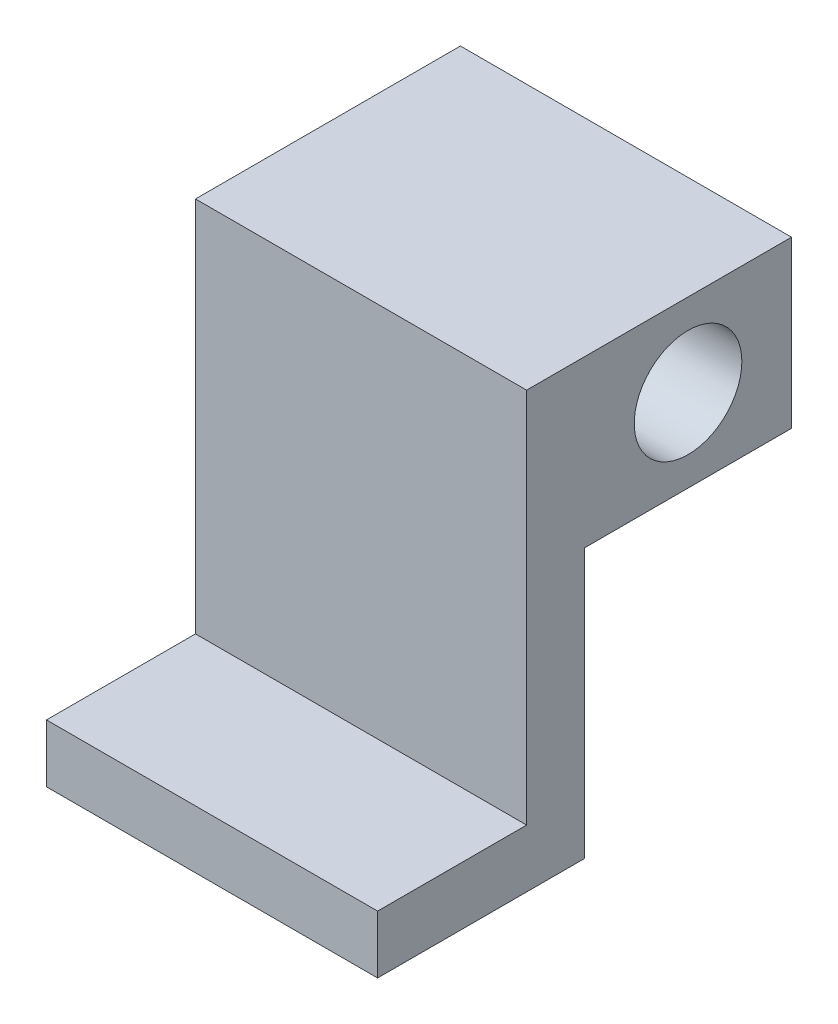
ISO-10303-21;
HEADER;
FILE_DESCRIPTION(('STEP AP214'),'2;1');
FILE_NAME('part.step','',(''),(''),'','','');
FILE_SCHEMA(('AUTOMOTIVE_DESIGN { 1 0 10303 214 1 1 1 1 }'));
ENDSEC;
DATA;
#1=APPLICATION_CONTEXT('core data for automotive mechanical design processes');
#2=APPLICATION_PROTOCOL_DEFINITION('international standard','automotive_design',2000,#1);
#3=PRODUCT_CONTEXT('',#1,'mechanical');
#4=PRODUCT('Part','Part','',(#3));
#5=PRODUCT_RELATED_PRODUCT_CATEGORY('part','',(#4));
#6=PRODUCT_DEFINITION_FORMATION('','',#4);
#7=PRODUCT_DEFINITION_CONTEXT('part definition',#1,'design');
#8=PRODUCT_DEFINITION('design','',#6,#7);
#9=PRODUCT_DEFINITION_SHAPE('','',#8);
#10=(LENGTH_UNIT() NAMED_UNIT(*) SI_UNIT(.MILLI.,.METRE.));
#11=(NAMED_UNIT(*) PLANE_ANGLE_UNIT() SI_UNIT($,.RADIAN.));
#12=(NAMED_UNIT(*) SI_UNIT($,.STERADIAN.) SOLID_ANGLE_UNIT());
#13=UNCERTAINTY_MEASURE_WITH_UNIT(LENGTH_MEASURE(1.E-05),#10,'distance_accuracy_value','');
#14=(GEOMETRIC_REPRESENTATION_CONTEXT(3) GLOBAL_UNCERTAINTY_ASSIGNED_CONTEXT((#13)) GLOBAL_UNIT_ASSIGNED_CONTEXT((#10,
#11,#12)) REPRESENTATION_CONTEXT('',''));
#15=CARTESIAN_POINT('',(0.,0.,0.));
#16=DIRECTION('',(0.,0.,1.));
#17=DIRECTION('',(1.,0.,0.));
#18=AXIS2_PLACEMENT_3D('',#15,#16,#17);
#19=CARTESIAN_POINT('',(0.,0.,19.5));
#20=DIRECTION('',(0.,0.,1.));
#21=DIRECTION('',(1.,0.,0.));
#22=AXIS2_PLACEMENT_3D('',#19,#20,#21);
#23=PLANE('',#22);
#24=DIRECTION('',(0.,-1.,0.));
#25=VECTOR('',#24,1.);
#26=CARTESIAN_POINT('',(95.820798407567,0.,19.5));
#27=LINE('',#26,#25);
#28=CARTESIAN_POINT('',(95.820798407567,9.99999999999999,19.5));
#29=VERTEX_POINT('',#28);
#30=CARTESIAN_POINT('',(95.820798407567,-35.5,19.5));
#31=VERTEX_POINT('',#30);
#32=EDGE_CURVE('E134',#29,#31,#27,.T.);
#33=ORIENTED_EDGE('',*,*,#32,.T.);
#34=DIRECTION('',(1.,0.,0.));
#35=VECTOR('',#34,1.);
#36=CARTESIAN_POINT('',(0.,-35.5,19.5));
#37=LINE('',#36,#35);
#38=CARTESIAN_POINT('',(135.820798407567,-35.5,19.5));
#39=VERTEX_POINT('',#38);
#40=EDGE_CURVE('E11',#31,#39,#37,.T.);
#41=ORIENTED_EDGE('',*,*,#40,.T.);
#42=DIRECTION('',(0.,1.,0.));
#43=VECTOR('',#42,1.);
#44=CARTESIAN_POINT('',(135.820798407567,0.,19.5));
#45=LINE('',#44,#43);
#46=CARTESIAN_POINT('',(135.820798407567,9.99999999999999,19.5));
#47=VERTEX_POINT('',#46);
#48=EDGE_CURVE('E168',#39,#47,#45,.T.);
#49=ORIENTED_EDGE('',*,*,#48,.T.);
#50=DIRECTION('',(-1.,0.,0.));
#51=VECTOR('',#50,1.);
#52=CARTESIAN_POINT('',(0.,10.,19.5));
#53=LINE('',#52,#51);
#54=EDGE_CURVE('E85',#47,#29,#53,.T.);
#55=ORIENTED_EDGE('',*,*,#54,.T.);
#56=EDGE_LOOP('',(#33,#41,#49,#55));
#57=FACE_BOUND('',#56,.T.);
#58=ADVANCED_FACE('F43',(#57),#23,.T.);
#59=CARTESIAN_POINT('',(95.820798407567,9.99999999999999,12.5));
#60=DIRECTION('',(1.,0.,0.));
#61=DIRECTION('',(0.,0.,-1.));
#62=AXIS2_PLACEMENT_3D('',#59,#60,#61);
#63=PLANE('',#62);
#64=DIRECTION('',(0.,0.,-1.));
#65=VECTOR('',#64,1.);
#66=CARTESIAN_POINT('',(95.820798407567,-42.5,19.5));
#67=LINE('',#66,#65);
#68=CARTESIAN_POINT('',(95.820798407567,-42.5,37.5));
#69=VERTEX_POINT('',#68);
#70=CARTESIAN_POINT('',(95.820798407567,-42.5,12.5));
#71=VERTEX_POINT('',#70);
#72=EDGE_CURVE('E117',#69,#71,#67,.T.);
#73=ORIENTED_EDGE('',*,*,#72,.F.);
#74=DIRECTION('',(0.,-1.,0.));
#75=VECTOR('',#74,1.);
#76=CARTESIAN_POINT('',(95.820798407567,0.,37.5));
#77=LINE('',#76,#75);
#78=CARTESIAN_POINT('',(95.820798407567,-35.5,37.5));
#79=VERTEX_POINT('',#78);
#80=EDGE_CURVE('E176',#79,#69,#77,.T.);
#81=ORIENTED_EDGE('',*,*,#80,.F.);
#82=DIRECTION('',(0.,0.,-1.));
#83=VECTOR('',#82,1.);
#84=CARTESIAN_POINT('',(95.820798407567,-35.5,37.5));
#85=LINE('',#84,#83);
#86=EDGE_CURVE('E169',#79,#31,#85,.T.);
#87=ORIENTED_EDGE('',*,*,#86,.T.);
#88=ORIENTED_EDGE('',*,*,#32,.F.);
#89=DIRECTION('',(0.,0.,-1.));
#90=VECTOR('',#89,1.);
#91=CARTESIAN_POINT('',(95.820798407567,9.99999999999999,12.5));
#92=LINE('',#91,#90);
#93=CARTESIAN_POINT('',(95.820798407567,9.99999999999999,-12.5));
#94=VERTEX_POINT('',#93);
#95=EDGE_CURVE('E89',#29,#94,#92,.T.);
#96=ORIENTED_EDGE('',*,*,#95,.T.);
#97=DIRECTION('',(0.,-1.,0.));
#98=VECTOR('',#97,1.);
#99=CARTESIAN_POINT('',(95.820798407567,9.99999999999999,-12.5));
#100=LINE('',#99,#98);
#101=CARTESIAN_POINT('',(95.820798407567,-10.,-12.5));
#102=VERTEX_POINT('',#101);
#103=EDGE_CURVE('E103',#94,#102,#100,.T.);
#104=ORIENTED_EDGE('',*,*,#103,.T.);
#105=DIRECTION('',(0.,0.,-1.));
#106=VECTOR('',#105,1.);
#107=CARTESIAN_POINT('',(95.820798407567,-10.,12.5));
#108=LINE('',#107,#106);
#109=CARTESIAN_POINT('',(95.820798407567,-10.,12.5));
#110=VERTEX_POINT('',#109);
#111=EDGE_CURVE('E52',#110,#102,#108,.T.);
#112=ORIENTED_EDGE('',*,*,#111,.F.);
#113=DIRECTION('',(0.,-1.,0.));
#114=VECTOR('',#113,1.);
#115=CARTESIAN_POINT('',(95.820798407567,0.,12.5));
#116=LINE('',#115,#114);
#117=EDGE_CURVE('E145',#110,#71,#116,.T.);
#118=ORIENTED_EDGE('',*,*,#117,.T.);
#119=EDGE_LOOP('',(#73,#81,#87,#88,#96,#104,#112,#118));
#120=FACE_BOUND('',#119,.T.);
#121=CARTESIAN_POINT('',(95.820798407567,0.,0.));
#122=DIRECTION('',(1.,0.,0.));
#123=DIRECTION('',(0.,0.,-1.));
#124=AXIS2_PLACEMENT_3D('',#121,#122,#123);
#125=CIRCLE('',#124,6.5);
#126=CARTESIAN_POINT('',(95.820798407567,0.,-6.5));
#127=VERTEX_POINT('',#126);
#128=EDGE_CURVE('E112',#127,#127,#125,.T.);
#129=ORIENTED_EDGE('',*,*,#128,.T.);
#130=EDGE_LOOP('',(#129));
#131=FACE_BOUND('',#130,.T.);
#132=ADVANCED_FACE('F45',(#120,#131),#63,.F.);
#133=CARTESIAN_POINT('',(95.820798407567,-10.,12.5));
#134=DIRECTION('',(0.,1.,0.));
#135=DIRECTION('',(-1.,0.,0.));
#136=AXIS2_PLACEMENT_3D('',#133,#134,#135);
#137=PLANE('',#136);
#138=DIRECTION('',(1.,0.,0.));
#139=VECTOR('',#138,1.);
#140=CARTESIAN_POINT('',(95.820798407567,-10.,-12.5));
#141=LINE('',#140,#139);
#142=CARTESIAN_POINT('',(135.820798407567,-9.99999999999999,-12.5));
#143=VERTEX_POINT('',#142);
#144=EDGE_CURVE('E98',#102,#143,#141,.T.);
#145=ORIENTED_EDGE('',*,*,#144,.T.);
#146=DIRECTION('',(0.,0.,-1.));
#147=VECTOR('',#146,1.);
#148=CARTESIAN_POINT('',(135.820798407567,-9.99999999999999,12.5));
#149=LINE('',#148,#147);
#150=CARTESIAN_POINT('',(135.820798407567,-10.,12.5));
#151=VERTEX_POINT('',#150);
#152=EDGE_CURVE('E88',#151,#143,#149,.T.);
#153=ORIENTED_EDGE('',*,*,#152,.F.);
#154=DIRECTION('',(1.,0.,0.));
#155=VECTOR('',#154,1.);
#156=CARTESIAN_POINT('',(95.820798407567,-10.,12.5));
#157=LINE('',#156,#155);
#158=EDGE_CURVE('E59',#110,#151,#157,.T.);
#159=ORIENTED_EDGE('',*,*,#158,.F.);
#160=ORIENTED_EDGE('',*,*,#111,.T.);
#161=EDGE_LOOP('',(#145,#153,#159,#160));
#162=FACE_BOUND('',#161,.T.);
#163=ADVANCED_FACE('F125',(#162),#137,.F.);
#164=CARTESIAN_POINT('',(135.820798407567,9.99999999999999,12.5));
#165=DIRECTION('',(1.,0.,0.));
#166=DIRECTION('',(0.,0.,-1.));
#167=AXIS2_PLACEMENT_3D('',#164,#165,#166);
#168=PLANE('',#167);
#169=DIRECTION('',(0.,1.,0.));
#170=VECTOR('',#169,1.);
#171=CARTESIAN_POINT('',(135.820798407567,0.,12.5));
#172=LINE('',#171,#170);
#173=CARTESIAN_POINT('',(135.820798407567,-42.5,12.5));
#174=VERTEX_POINT('',#173);
#175=EDGE_CURVE('E187',#174,#151,#172,.T.);
#176=ORIENTED_EDGE('',*,*,#175,.T.);
#177=ORIENTED_EDGE('',*,*,#152,.T.);
#178=DIRECTION('',(0.,-1.,0.));
#179=VECTOR('',#178,1.);
#180=CARTESIAN_POINT('',(135.820798407567,9.99999999999999,-12.5));
#181=LINE('',#180,#179);
#182=CARTESIAN_POINT('',(135.820798407567,9.99999999999999,-12.5));
#183=VERTEX_POINT('',#182);
#184=EDGE_CURVE('E92',#183,#143,#181,.T.);
#185=ORIENTED_EDGE('',*,*,#184,.F.);
#186=DIRECTION('',(0.,0.,-1.));
#187=VECTOR('',#186,1.);
#188=CARTESIAN_POINT('',(135.820798407567,9.99999999999999,12.5));
#189=LINE('',#188,#187);
#190=EDGE_CURVE('E77',#47,#183,#189,.T.);
#191=ORIENTED_EDGE('',*,*,#190,.F.);
#192=ORIENTED_EDGE('',*,*,#48,.F.);
#193=DIRECTION('',(0.,0.,-1.));
#194=VECTOR('',#193,1.);
#195=CARTESIAN_POINT('',(135.820798407567,-35.5,37.5));
#196=LINE('',#195,#194);
#197=CARTESIAN_POINT('',(135.820798407567,-35.5,37.5));
#198=VERTEX_POINT('',#197);
#199=EDGE_CURVE('E152',#198,#39,#196,.T.);
#200=ORIENTED_EDGE('',*,*,#199,.F.);
#201=DIRECTION('',(0.,-1.,0.));
#202=VECTOR('',#201,1.);
#203=CARTESIAN_POINT('',(135.820798407567,0.,37.5));
#204=LINE('',#203,#202);
#205=CARTESIAN_POINT('',(135.820798407567,-42.5,37.5));
#206=VERTEX_POINT('',#205);
#207=EDGE_CURVE('E166',#198,#206,#204,.T.);
#208=ORIENTED_EDGE('',*,*,#207,.T.);
#209=DIRECTION('',(0.,0.,-1.));
#210=VECTOR('',#209,1.);
#211=CARTESIAN_POINT('',(135.820798407567,-42.5,19.5));
#212=LINE('',#211,#210);
#213=EDGE_CURVE('E122',#206,#174,#212,.T.);
#214=ORIENTED_EDGE('',*,*,#213,.T.);
#215=EDGE_LOOP('',(#176,#177,#185,#191,#192,#200,#208,#214));
#216=FACE_BOUND('',#215,.T.);
#217=CARTESIAN_POINT('',(135.820798407567,0.,0.));
#218=DIRECTION('',(1.,0.,0.));
#219=DIRECTION('',(0.,0.,-1.));
#220=AXIS2_PLACEMENT_3D('',#217,#218,#219);
#221=CIRCLE('',#220,6.5);
#222=CARTESIAN_POINT('',(135.820798407567,0.,-6.5));
#223=VERTEX_POINT('',#222);
#224=EDGE_CURVE('E110',#223,#223,#221,.T.);
#225=ORIENTED_EDGE('',*,*,#224,.F.);
#226=EDGE_LOOP('',(#225));
#227=FACE_BOUND('',#226,.T.);
#228=ADVANCED_FACE('F94',(#216,#227),#168,.T.);
#229=CARTESIAN_POINT('',(95.820798407567,9.99999999999999,12.5));
#230=DIRECTION('',(0.,1.,0.));
#231=DIRECTION('',(-1.,0.,0.));
#232=AXIS2_PLACEMENT_3D('',#229,#230,#231);
#233=PLANE('',#232);
#234=DIRECTION('',(1.,0.,0.));
#235=VECTOR('',#234,1.);
#236=CARTESIAN_POINT('',(95.820798407567,9.99999999999999,-12.5));
#237=LINE('',#236,#235);
#238=EDGE_CURVE('E82',#94,#183,#237,.T.);
#239=ORIENTED_EDGE('',*,*,#238,.F.);
#240=ORIENTED_EDGE('',*,*,#95,.F.);
#241=ORIENTED_EDGE('',*,*,#54,.F.);
#242=ORIENTED_EDGE('',*,*,#190,.T.);
#243=EDGE_LOOP('',(#239,#240,#241,#242));
#244=FACE_BOUND('',#243,.T.);
#245=ADVANCED_FACE('F79',(#244),#233,.T.);
#246=CARTESIAN_POINT('',(0.,0.,-12.5));
#247=DIRECTION('',(0.,0.,1.));
#248=DIRECTION('',(1.,0.,0.));
#249=AXIS2_PLACEMENT_3D('',#246,#247,#248);
#250=PLANE('',#249);
#251=ORIENTED_EDGE('',*,*,#103,.F.);
#252=ORIENTED_EDGE('',*,*,#238,.T.);
#253=ORIENTED_EDGE('',*,*,#184,.T.);
#254=ORIENTED_EDGE('',*,*,#144,.F.);
#255=EDGE_LOOP('',(#251,#252,#253,#254));
#256=FACE_BOUND('',#255,.T.);
#257=ADVANCED_FACE('F101',(#256),#250,.F.);
#258=CARTESIAN_POINT('',(95.820798407567,0.,0.));
#259=DIRECTION('',(1.,0.,0.));
#260=DIRECTION('',(0.,0.,-1.));
#261=AXIS2_PLACEMENT_3D('',#258,#259,#260);
#262=CYLINDRICAL_SURFACE('',#261,6.5);
#263=ORIENTED_EDGE('',*,*,#224,.T.);
#264=EDGE_LOOP('',(#263));
#265=FACE_BOUND('',#264,.T.);
#266=ORIENTED_EDGE('',*,*,#128,.F.);
#267=EDGE_LOOP('',(#266));
#268=FACE_BOUND('',#267,.T.);
#269=ADVANCED_FACE('F212',(#265,#268),#262,.F.);
#270=CARTESIAN_POINT('',(0.,0.,12.5));
#271=DIRECTION('',(0.,0.,1.));
#272=DIRECTION('',(1.,0.,0.));
#273=AXIS2_PLACEMENT_3D('',#270,#271,#272);
#274=PLANE('',#273);
#275=DIRECTION('',(-1.,0.,0.));
#276=VECTOR('',#275,1.);
#277=CARTESIAN_POINT('',(0.,-42.5,12.5));
#278=LINE('',#277,#276);
#279=EDGE_CURVE('E191',#174,#71,#278,.T.);
#280=ORIENTED_EDGE('',*,*,#279,.T.);
#281=ORIENTED_EDGE('',*,*,#117,.F.);
#282=ORIENTED_EDGE('',*,*,#158,.T.);
#283=ORIENTED_EDGE('',*,*,#175,.F.);
#284=EDGE_LOOP('',(#280,#281,#282,#283));
#285=FACE_BOUND('',#284,.T.);
#286=ADVANCED_FACE('F198',(#285),#274,.F.);
#287=CARTESIAN_POINT('',(0.,-42.5,19.5));
#288=DIRECTION('',(0.,-1.,0.));
#289=DIRECTION('',(0.,0.,-1.));
#290=AXIS2_PLACEMENT_3D('',#287,#288,#289);
#291=PLANE('',#290);
#292=ORIENTED_EDGE('',*,*,#279,.F.);
#293=ORIENTED_EDGE('',*,*,#213,.F.);
#294=DIRECTION('',(-1.,0.,0.));
#295=VECTOR('',#294,1.);
#296=CARTESIAN_POINT('',(0.,-42.5,37.5));
#297=LINE('',#296,#295);
#298=EDGE_CURVE('E180',#206,#69,#297,.T.);
#299=ORIENTED_EDGE('',*,*,#298,.T.);
#300=ORIENTED_EDGE('',*,*,#72,.T.);
#301=EDGE_LOOP('',(#292,#293,#299,#300));
#302=FACE_BOUND('',#301,.T.);
#303=ADVANCED_FACE('F199',(#302),#291,.T.);
#304=CARTESIAN_POINT('',(0.,-35.5,37.5));
#305=DIRECTION('',(0.,-1.,0.));
#306=DIRECTION('',(0.,0.,-1.));
#307=AXIS2_PLACEMENT_3D('',#304,#305,#306);
#308=PLANE('',#307);
#309=ORIENTED_EDGE('',*,*,#40,.F.);
#310=ORIENTED_EDGE('',*,*,#86,.F.);
#311=DIRECTION('',(-1.,0.,0.));
#312=VECTOR('',#311,1.);
#313=CARTESIAN_POINT('',(0.,-35.5,37.5));
#314=LINE('',#313,#312);
#315=EDGE_CURVE('E171',#198,#79,#314,.T.);
#316=ORIENTED_EDGE('',*,*,#315,.F.);
#317=ORIENTED_EDGE('',*,*,#199,.T.);
#318=EDGE_LOOP('',(#309,#310,#316,#317));
#319=FACE_BOUND('',#318,.T.);
#320=ADVANCED_FACE('F172',(#319),#308,.F.);
#321=CARTESIAN_POINT('',(0.,0.,37.5));
#322=DIRECTION('',(0.,0.,1.));
#323=DIRECTION('',(1.,0.,0.));
#324=AXIS2_PLACEMENT_3D('',#321,#322,#323);
#325=PLANE('',#324);
#326=ORIENTED_EDGE('',*,*,#207,.F.);
#327=ORIENTED_EDGE('',*,*,#315,.T.);
#328=ORIENTED_EDGE('',*,*,#80,.T.);
#329=ORIENTED_EDGE('',*,*,#298,.F.);
#330=EDGE_LOOP('',(#326,#327,#328,#329));
#331=FACE_BOUND('',#330,.T.);
#332=ADVANCED_FACE('F178',(#331),#325,.T.);
#333=CLOSED_SHELL('',(#58,#132,#163,#228,#245,#257,#269,#286,#303,#320,#332));
#334=MANIFOLD_SOLID_BREP('B2',#333);
#335=ADVANCED_BREP_SHAPE_REPRESENTATION('',(#18,#334),#14);
#336=SHAPE_DEFINITION_REPRESENTATION(#9,#335);
ENDSEC;
END-ISO-10303-21;
